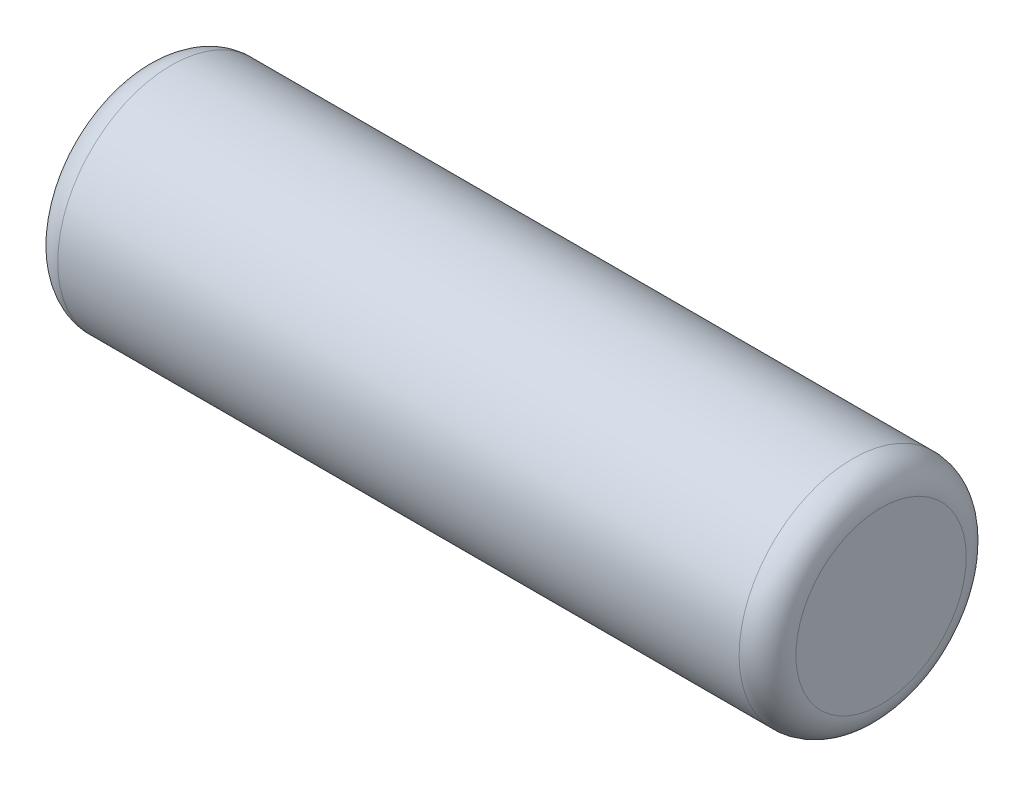
ISO-10303-21;
HEADER;
FILE_DESCRIPTION(('STEP AP214'),'2;1');
FILE_NAME('part.step','',(''),(''),'','','');
FILE_SCHEMA(('AUTOMOTIVE_DESIGN { 1 0 10303 214 1 1 1 1 }'));
ENDSEC;
DATA;
#1=APPLICATION_CONTEXT('core data for automotive mechanical design processes');
#2=APPLICATION_PROTOCOL_DEFINITION('international standard','automotive_design',2000,#1);
#3=PRODUCT_CONTEXT('',#1,'mechanical');
#4=PRODUCT('Part','Part','',(#3));
#5=PRODUCT_RELATED_PRODUCT_CATEGORY('part','',(#4));
#6=PRODUCT_DEFINITION_FORMATION('','',#4);
#7=PRODUCT_DEFINITION_CONTEXT('part definition',#1,'design');
#8=PRODUCT_DEFINITION('design','',#6,#7);
#9=PRODUCT_DEFINITION_SHAPE('','',#8);
#10=(LENGTH_UNIT() NAMED_UNIT(*) SI_UNIT(.MILLI.,.METRE.));
#11=(NAMED_UNIT(*) PLANE_ANGLE_UNIT() SI_UNIT($,.RADIAN.));
#12=(NAMED_UNIT(*) SI_UNIT($,.STERADIAN.) SOLID_ANGLE_UNIT());
#13=UNCERTAINTY_MEASURE_WITH_UNIT(LENGTH_MEASURE(1.E-05),#10,'distance_accuracy_value','');
#14=(GEOMETRIC_REPRESENTATION_CONTEXT(3) GLOBAL_UNCERTAINTY_ASSIGNED_CONTEXT((#13)) GLOBAL_UNIT_ASSIGNED_CONTEXT((#10,
#11,#12)) REPRESENTATION_CONTEXT('',''));
#15=CARTESIAN_POINT('',(0.,0.,0.));
#16=DIRECTION('',(0.,0.,1.));
#17=DIRECTION('',(1.,0.,0.));
#18=AXIS2_PLACEMENT_3D('',#15,#16,#17);
#19=CARTESIAN_POINT('',(52.,0.,0.));
#20=DIRECTION('',(-1.,0.,0.));
#21=DIRECTION('',(0.,0.,1.));
#22=AXIS2_PLACEMENT_3D('',#19,#20,#21);
#23=CYLINDRICAL_SURFACE('',#22,8.);
#24=CARTESIAN_POINT('',(1.99999999999999,0.,0.));
#25=DIRECTION('',(1.,0.,0.));
#26=DIRECTION('',(0.,0.,-1.));
#27=AXIS2_PLACEMENT_3D('',#24,#25,#26);
#28=CIRCLE('',#27,8.);
#29=CARTESIAN_POINT('',(1.99999999999999,0.,8.));
#30=VERTEX_POINT('',#29);
#31=EDGE_CURVE('E42',#30,#30,#28,.T.);
#32=CARTESIAN_POINT('',(50.,0.,0.));
#33=DIRECTION('',(1.,0.,0.));
#34=DIRECTION('',(0.,0.,-1.));
#35=AXIS2_PLACEMENT_3D('',#32,#33,#34);
#36=CIRCLE('',#35,8.);
#37=CARTESIAN_POINT('',(50.,0.,8.));
#38=VERTEX_POINT('',#37);
#39=EDGE_CURVE('E46',#38,#38,#36,.F.);
#40=CARTESIAN_POINT('',(1.99999999999999,0.,8.));
#41=CARTESIAN_POINT('',(2.49999999999999,0.,8.));
#42=CARTESIAN_POINT('',(2.99999999999999,0.,8.));
#43=CARTESIAN_POINT('',(3.99999999999999,0.,8.));
#44=CARTESIAN_POINT('',(4.49999999999999,0.,8.));
#45=CARTESIAN_POINT('',(5.49999999999999,0.,8.));
#46=CARTESIAN_POINT('',(5.99999999999999,0.,8.));
#47=CARTESIAN_POINT('',(6.99999999999999,0.,8.));
#48=CARTESIAN_POINT('',(7.49999999999999,0.,8.));
#49=CARTESIAN_POINT('',(8.49999999999999,0.,8.));
#50=CARTESIAN_POINT('',(8.99999999999999,0.,8.));
#51=CARTESIAN_POINT('',(9.99999999999999,0.,8.));
#52=CARTESIAN_POINT('',(10.5,0.,8.));
#53=CARTESIAN_POINT('',(11.5,0.,8.));
#54=CARTESIAN_POINT('',(12.,0.,8.));
#55=CARTESIAN_POINT('',(13.,0.,8.));
#56=CARTESIAN_POINT('',(13.5,0.,8.));
#57=CARTESIAN_POINT('',(14.5,0.,8.));
#58=CARTESIAN_POINT('',(15.,0.,8.));
#59=CARTESIAN_POINT('',(16.,0.,8.));
#60=CARTESIAN_POINT('',(16.5,0.,8.));
#61=CARTESIAN_POINT('',(17.5,0.,8.));
#62=CARTESIAN_POINT('',(18.,0.,8.));
#63=CARTESIAN_POINT('',(19.,0.,8.));
#64=CARTESIAN_POINT('',(19.5,0.,8.));
#65=CARTESIAN_POINT('',(20.5,0.,8.));
#66=CARTESIAN_POINT('',(21.,0.,8.));
#67=CARTESIAN_POINT('',(22.,0.,8.));
#68=CARTESIAN_POINT('',(22.5,0.,8.));
#69=CARTESIAN_POINT('',(23.5,0.,8.));
#70=CARTESIAN_POINT('',(24.,0.,8.));
#71=CARTESIAN_POINT('',(25.,0.,8.));
#72=CARTESIAN_POINT('',(25.5,0.,8.));
#73=CARTESIAN_POINT('',(26.5,0.,8.));
#74=CARTESIAN_POINT('',(27.,0.,8.));
#75=CARTESIAN_POINT('',(28.,0.,8.));
#76=CARTESIAN_POINT('',(28.5,0.,8.));
#77=CARTESIAN_POINT('',(29.5,0.,8.));
#78=CARTESIAN_POINT('',(30.,0.,8.));
#79=CARTESIAN_POINT('',(31.,0.,8.));
#80=CARTESIAN_POINT('',(31.5,0.,8.));
#81=CARTESIAN_POINT('',(32.5,0.,8.));
#82=CARTESIAN_POINT('',(33.,0.,8.));
#83=CARTESIAN_POINT('',(34.,0.,8.));
#84=CARTESIAN_POINT('',(34.5,0.,8.));
#85=CARTESIAN_POINT('',(35.5,0.,8.));
#86=CARTESIAN_POINT('',(36.,0.,8.));
#87=CARTESIAN_POINT('',(37.,0.,8.));
#88=CARTESIAN_POINT('',(37.5,0.,8.));
#89=CARTESIAN_POINT('',(38.5,0.,8.));
#90=CARTESIAN_POINT('',(39.,0.,8.));
#91=CARTESIAN_POINT('',(40.,0.,8.));
#92=CARTESIAN_POINT('',(40.5,0.,8.));
#93=CARTESIAN_POINT('',(41.5,0.,8.));
#94=CARTESIAN_POINT('',(42.,0.,8.));
#95=CARTESIAN_POINT('',(43.,0.,8.));
#96=CARTESIAN_POINT('',(43.5,0.,8.));
#97=CARTESIAN_POINT('',(44.5,0.,8.));
#98=CARTESIAN_POINT('',(45.,0.,8.));
#99=CARTESIAN_POINT('',(46.,0.,8.));
#100=CARTESIAN_POINT('',(46.5,0.,8.));
#101=CARTESIAN_POINT('',(47.5,0.,8.));
#102=CARTESIAN_POINT('',(48.,0.,8.));
#103=CARTESIAN_POINT('',(49.,0.,8.));
#104=CARTESIAN_POINT('',(49.5,0.,8.));
#105=CARTESIAN_POINT('',(50.,0.,8.));
#106=B_SPLINE_CURVE_WITH_KNOTS('',3,(#40,#41,#42,#43,#44,#45,#46,#47,#48,#49,#50,#51,#52,#53,
#54,#55,#56,#57,#58,#59,#60,#61,#62,#63,#64,#65,#66,#67,#68,#69,#70,#71,#72,#73,#74,#75,#76,#77,
#78,#79,#80,#81,#82,#83,#84,#85,#86,#87,#88,#89,#90,#91,#92,#93,#94,#95,#96,#97,#98,#99,#100,
#101,#102,#103,#104,#105),.UNSPECIFIED.,.F.,.F.,(4,2,2,2,2,2,2,2,2,2,2,2,2,2,2,2,2,2,2,2,2,2,2,
2,2,2,2,2,2,2,2,2,4),(0.,1.5,3.,4.5,6.00000000000001,7.5,9.,10.5,12.,13.5,15.,16.5,18.,19.5,21.,
22.5,24.,25.5,27.,28.5,30.,31.5,33.,34.5,36.,37.5,39.,40.5,42.,43.5,45.,46.5,48.),.UNSPECIFIED.);
#107=EDGE_CURVE('BSEAM31',#30,#38,#106,.T.);
#108=ORIENTED_EDGE('',*,*,#31,.T.);
#109=ORIENTED_EDGE('',*,*,#39,.T.);
#110=ORIENTED_EDGE('',*,*,#107,.T.);
#111=ORIENTED_EDGE('',*,*,#107,.F.);
#112=EDGE_LOOP('',(#108,#110,#109,#111));
#113=FACE_BOUND('',#112,.T.);
#114=ADVANCED_FACE('F31',(#113),#23,.T.);
#115=CARTESIAN_POINT('',(52.,0.,0.));
#116=DIRECTION('',(1.,0.,0.));
#117=DIRECTION('',(0.,0.,-1.));
#118=AXIS2_PLACEMENT_3D('',#115,#116,#117);
#119=PLANE('',#118);
#120=CARTESIAN_POINT('',(52.,0.,0.));
#121=DIRECTION('',(1.,0.,0.));
#122=DIRECTION('',(0.,0.,-1.));
#123=AXIS2_PLACEMENT_3D('',#120,#121,#122);
#124=CIRCLE('',#123,6.);
#125=CARTESIAN_POINT('',(52.,0.,-6.));
#126=VERTEX_POINT('',#125);
#127=EDGE_CURVE('E10',#126,#126,#124,.T.);
#128=ORIENTED_EDGE('',*,*,#127,.T.);
#129=EDGE_LOOP('',(#128));
#130=FACE_BOUND('',#129,.T.);
#131=ADVANCED_FACE('F62',(#130),#119,.T.);
#132=CARTESIAN_POINT('',(0.,0.,0.));
#133=DIRECTION('',(1.,0.,0.));
#134=DIRECTION('',(0.,0.,-1.));
#135=AXIS2_PLACEMENT_3D('',#132,#133,#134);
#136=PLANE('',#135);
#137=CARTESIAN_POINT('',(0.,0.,0.));
#138=DIRECTION('',(1.,0.,0.));
#139=DIRECTION('',(0.,0.,-1.));
#140=AXIS2_PLACEMENT_3D('',#137,#138,#139);
#141=CIRCLE('',#140,6.);
#142=CARTESIAN_POINT('',(0.,0.,-6.));
#143=VERTEX_POINT('',#142);
#144=EDGE_CURVE('E38',#143,#143,#141,.F.);
#145=ORIENTED_EDGE('',*,*,#144,.T.);
#146=EDGE_LOOP('',(#145));
#147=FACE_BOUND('',#146,.T.);
#148=ADVANCED_FACE('F59',(#147),#136,.F.);
#149=CARTESIAN_POINT('',(2.,0.,0.));
#150=DIRECTION('',(1.,0.,0.));
#151=DIRECTION('',(0.,0.,-1.));
#152=AXIS2_PLACEMENT_3D('',#149,#150,#151);
#153=TOROIDAL_SURFACE('',#152,6.,2.);
#154=ORIENTED_EDGE('',*,*,#144,.F.);
#155=EDGE_LOOP('',(#154));
#156=FACE_BOUND('',#155,.T.);
#157=ORIENTED_EDGE('',*,*,#31,.F.);
#158=EDGE_LOOP('',(#157));
#159=FACE_BOUND('',#158,.T.);
#160=ADVANCED_FACE('F55',(#156,#159),#153,.T.);
#161=CARTESIAN_POINT('',(50.,0.,0.));
#162=DIRECTION('',(1.,0.,0.));
#163=DIRECTION('',(0.,0.,-1.));
#164=AXIS2_PLACEMENT_3D('',#161,#162,#163);
#165=TOROIDAL_SURFACE('',#164,6.,2.);
#166=ORIENTED_EDGE('',*,*,#39,.F.);
#167=EDGE_LOOP('',(#166));
#168=FACE_BOUND('',#167,.T.);
#169=ORIENTED_EDGE('',*,*,#127,.F.);
#170=EDGE_LOOP('',(#169));
#171=FACE_BOUND('',#170,.T.);
#172=ADVANCED_FACE('F33',(#168,#171),#165,.T.);
#173=CLOSED_SHELL('',(#114,#131,#148,#160,#172));
#174=MANIFOLD_SOLID_BREP('B2',#173);
#175=ADVANCED_BREP_SHAPE_REPRESENTATION('',(#18,#174),#14);
#176=SHAPE_DEFINITION_REPRESENTATION(#9,#175);
ENDSEC;
END-ISO-10303-21;
